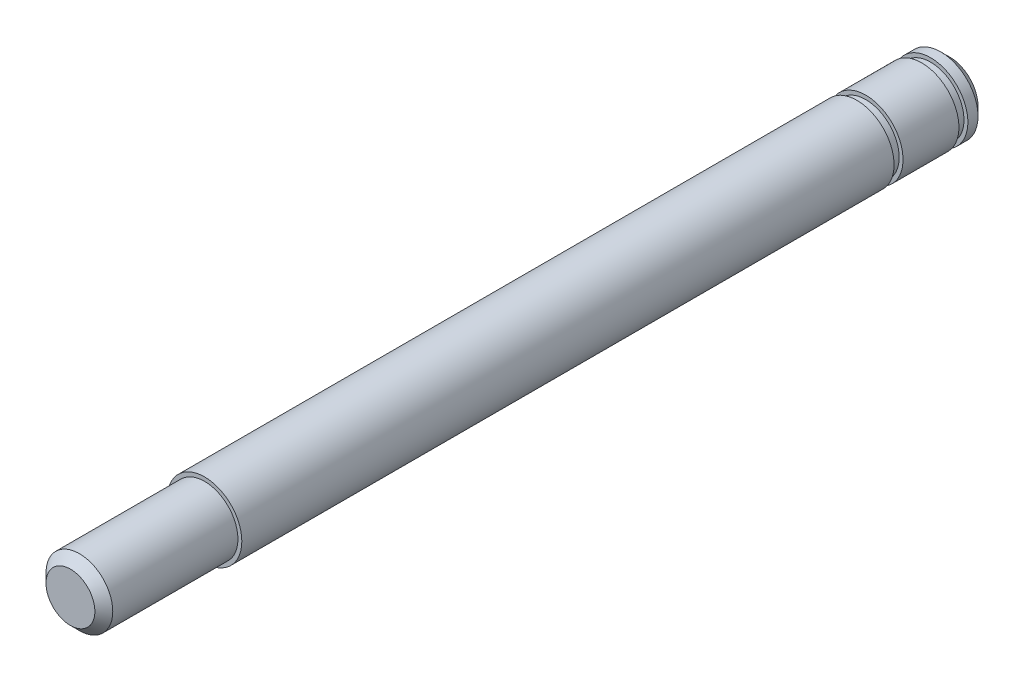
ISO-10303-21;
HEADER;
FILE_DESCRIPTION(('STEP AP214'),'2;1');
FILE_NAME('part.step','',(''),(''),'','','');
FILE_SCHEMA(('AUTOMOTIVE_DESIGN { 1 0 10303 214 1 1 1 1 }'));
ENDSEC;
DATA;
#1=APPLICATION_CONTEXT('core data for automotive mechanical design processes');
#2=APPLICATION_PROTOCOL_DEFINITION('international standard','automotive_design',2000,#1);
#3=PRODUCT_CONTEXT('',#1,'mechanical');
#4=PRODUCT('Part','Part','',(#3));
#5=PRODUCT_RELATED_PRODUCT_CATEGORY('part','',(#4));
#6=PRODUCT_DEFINITION_FORMATION('','',#4);
#7=PRODUCT_DEFINITION_CONTEXT('part definition',#1,'design');
#8=PRODUCT_DEFINITION('design','',#6,#7);
#9=PRODUCT_DEFINITION_SHAPE('','',#8);
#10=(LENGTH_UNIT() NAMED_UNIT(*) SI_UNIT(.MILLI.,.METRE.));
#11=(NAMED_UNIT(*) PLANE_ANGLE_UNIT() SI_UNIT($,.RADIAN.));
#12=(NAMED_UNIT(*) SI_UNIT($,.STERADIAN.) SOLID_ANGLE_UNIT());
#13=UNCERTAINTY_MEASURE_WITH_UNIT(LENGTH_MEASURE(1.E-05),#10,'distance_accuracy_value','');
#14=(GEOMETRIC_REPRESENTATION_CONTEXT(3) GLOBAL_UNCERTAINTY_ASSIGNED_CONTEXT((#13)) GLOBAL_UNIT_ASSIGNED_CONTEXT((#10,
#11,#12)) REPRESENTATION_CONTEXT('',''));
#15=CARTESIAN_POINT('',(0.,0.,0.));
#16=DIRECTION('',(0.,0.,1.));
#17=DIRECTION('',(1.,0.,0.));
#18=AXIS2_PLACEMENT_3D('',#15,#16,#17);
#19=CARTESIAN_POINT('',(0.,0.,15.875));
#20=DIRECTION('',(0.,0.,-1.));
#21=DIRECTION('',(-1.,0.,0.));
#22=AXIS2_PLACEMENT_3D('',#19,#20,#21);
#23=CYLINDRICAL_SURFACE('',#22,1.5875);
#24=CARTESIAN_POINT('',(0.,0.,-12.29995));
#25=DIRECTION('',(0.,0.,-1.));
#26=DIRECTION('',(-1.,0.,0.));
#27=AXIS2_PLACEMENT_3D('',#24,#25,#26);
#28=CIRCLE('',#27,1.5875);
#29=CARTESIAN_POINT('',(-1.5875,0.,-12.29995));
#30=VERTEX_POINT('',#29);
#31=EDGE_CURVE('E83',#30,#30,#28,.T.);
#32=ORIENTED_EDGE('',*,*,#31,.T.);
#33=EDGE_LOOP('',(#32));
#34=FACE_BOUND('',#33,.T.);
#35=CARTESIAN_POINT('',(0.,0.,-14.6812));
#36=DIRECTION('',(0.,0.,-1.));
#37=DIRECTION('',(-1.,0.,0.));
#38=AXIS2_PLACEMENT_3D('',#35,#36,#37);
#39=CIRCLE('',#38,1.5875);
#40=CARTESIAN_POINT('',(-1.5875,0.,-14.6812));
#41=VERTEX_POINT('',#40);
#42=EDGE_CURVE('E68',#41,#41,#39,.T.);
#43=ORIENTED_EDGE('',*,*,#42,.F.);
#44=EDGE_LOOP('',(#43));
#45=FACE_BOUND('',#44,.T.);
#46=ADVANCED_FACE('F44',(#34,#45),#23,.T.);
#47=CARTESIAN_POINT('',(0.,0.,-14.6812));
#48=DIRECTION('',(0.,0.,-1.));
#49=DIRECTION('',(-1.,0.,0.));
#50=AXIS2_PLACEMENT_3D('',#47,#48,#49);
#51=PLANE('',#50);
#52=CARTESIAN_POINT('',(0.,0.,-14.6812));
#53=DIRECTION('',(0.,0.,-1.));
#54=DIRECTION('',(-1.,0.,0.));
#55=AXIS2_PLACEMENT_3D('',#52,#53,#54);
#56=CIRCLE('',#55,1.4224);
#57=CARTESIAN_POINT('',(-1.4224,0.,-14.6812));
#58=VERTEX_POINT('',#57);
#59=EDGE_CURVE('E74',#58,#58,#56,.T.);
#60=ORIENTED_EDGE('',*,*,#59,.F.);
#61=EDGE_LOOP('',(#60));
#62=FACE_BOUND('',#61,.T.);
#63=ORIENTED_EDGE('',*,*,#42,.T.);
#64=EDGE_LOOP('',(#63));
#65=FACE_BOUND('',#64,.T.);
#66=ADVANCED_FACE('F123',(#62,#65),#51,.T.);
#67=CARTESIAN_POINT('',(0.,0.,-15.0622));
#68=DIRECTION('',(0.,0.,-1.));
#69=DIRECTION('',(-1.,0.,0.));
#70=AXIS2_PLACEMENT_3D('',#67,#68,#69);
#71=PLANE('',#70);
#72=CARTESIAN_POINT('',(0.,0.,-15.0622));
#73=DIRECTION('',(0.,0.,-1.));
#74=DIRECTION('',(-1.,0.,0.));
#75=AXIS2_PLACEMENT_3D('',#72,#73,#74);
#76=CIRCLE('',#75,1.4224);
#77=CARTESIAN_POINT('',(-1.4224,0.,-15.0622));
#78=VERTEX_POINT('',#77);
#79=EDGE_CURVE('E77',#78,#78,#76,.T.);
#80=ORIENTED_EDGE('',*,*,#79,.T.);
#81=EDGE_LOOP('',(#80));
#82=FACE_BOUND('',#81,.T.);
#83=CARTESIAN_POINT('',(0.,0.,-15.0622));
#84=DIRECTION('',(0.,0.,-1.));
#85=DIRECTION('',(-1.,0.,0.));
#86=AXIS2_PLACEMENT_3D('',#83,#84,#85);
#87=CIRCLE('',#86,1.5875);
#88=CARTESIAN_POINT('',(-1.5875,0.,-15.0622));
#89=VERTEX_POINT('',#88);
#90=EDGE_CURVE('E71',#89,#89,#87,.T.);
#91=ORIENTED_EDGE('',*,*,#90,.F.);
#92=EDGE_LOOP('',(#91));
#93=FACE_BOUND('',#92,.T.);
#94=ADVANCED_FACE('F134',(#82,#93),#71,.F.);
#95=CARTESIAN_POINT('',(0.,0.,-14.6812));
#96=DIRECTION('',(0.,0.,-1.));
#97=DIRECTION('',(-1.,0.,0.));
#98=AXIS2_PLACEMENT_3D('',#95,#96,#97);
#99=CYLINDRICAL_SURFACE('',#98,1.4224);
#100=CARTESIAN_POINT('',(-1.4224,0.,-14.6812));
#101=CARTESIAN_POINT('',(-1.4224,0.,-14.68516875));
#102=CARTESIAN_POINT('',(-1.4224,0.,-14.6891375));
#103=CARTESIAN_POINT('',(-1.4224,0.,-14.697075));
#104=CARTESIAN_POINT('',(-1.4224,0.,-14.70104375));
#105=CARTESIAN_POINT('',(-1.4224,0.,-14.70898125));
#106=CARTESIAN_POINT('',(-1.4224,0.,-14.71295));
#107=CARTESIAN_POINT('',(-1.4224,0.,-14.7208875));
#108=CARTESIAN_POINT('',(-1.4224,0.,-14.72485625));
#109=CARTESIAN_POINT('',(-1.4224,0.,-14.73279375));
#110=CARTESIAN_POINT('',(-1.4224,0.,-14.7367625));
#111=CARTESIAN_POINT('',(-1.4224,0.,-14.7447));
#112=CARTESIAN_POINT('',(-1.4224,0.,-14.74866875));
#113=CARTESIAN_POINT('',(-1.4224,0.,-14.75660625));
#114=CARTESIAN_POINT('',(-1.4224,0.,-14.760575));
#115=CARTESIAN_POINT('',(-1.4224,0.,-14.7685125));
#116=CARTESIAN_POINT('',(-1.4224,0.,-14.77248125));
#117=CARTESIAN_POINT('',(-1.4224,0.,-14.78041875));
#118=CARTESIAN_POINT('',(-1.4224,0.,-14.7843875));
#119=CARTESIAN_POINT('',(-1.4224,0.,-14.792325));
#120=CARTESIAN_POINT('',(-1.4224,0.,-14.79629375));
#121=CARTESIAN_POINT('',(-1.4224,0.,-14.80423125));
#122=CARTESIAN_POINT('',(-1.4224,0.,-14.8082));
#123=CARTESIAN_POINT('',(-1.4224,0.,-14.8161375));
#124=CARTESIAN_POINT('',(-1.4224,0.,-14.82010625));
#125=CARTESIAN_POINT('',(-1.4224,0.,-14.82804375));
#126=CARTESIAN_POINT('',(-1.4224,0.,-14.8320125));
#127=CARTESIAN_POINT('',(-1.4224,0.,-14.83995));
#128=CARTESIAN_POINT('',(-1.4224,0.,-14.84391875));
#129=CARTESIAN_POINT('',(-1.4224,0.,-14.85185625));
#130=CARTESIAN_POINT('',(-1.4224,0.,-14.855825));
#131=CARTESIAN_POINT('',(-1.4224,0.,-14.8637625));
#132=CARTESIAN_POINT('',(-1.4224,0.,-14.86773125));
#133=CARTESIAN_POINT('',(-1.4224,0.,-14.87566875));
#134=CARTESIAN_POINT('',(-1.4224,0.,-14.8796375));
#135=CARTESIAN_POINT('',(-1.4224,0.,-14.887575));
#136=CARTESIAN_POINT('',(-1.4224,0.,-14.89154375));
#137=CARTESIAN_POINT('',(-1.4224,0.,-14.89948125));
#138=CARTESIAN_POINT('',(-1.4224,0.,-14.90345));
#139=CARTESIAN_POINT('',(-1.4224,0.,-14.9113875));
#140=CARTESIAN_POINT('',(-1.4224,0.,-14.91535625));
#141=CARTESIAN_POINT('',(-1.4224,0.,-14.92329375));
#142=CARTESIAN_POINT('',(-1.4224,0.,-14.9272625));
#143=CARTESIAN_POINT('',(-1.4224,0.,-14.9352));
#144=CARTESIAN_POINT('',(-1.4224,0.,-14.93916875));
#145=CARTESIAN_POINT('',(-1.4224,0.,-14.94710625));
#146=CARTESIAN_POINT('',(-1.4224,0.,-14.951075));
#147=CARTESIAN_POINT('',(-1.4224,0.,-14.9590125));
#148=CARTESIAN_POINT('',(-1.4224,0.,-14.96298125));
#149=CARTESIAN_POINT('',(-1.4224,0.,-14.97091875));
#150=CARTESIAN_POINT('',(-1.4224,0.,-14.9748875));
#151=CARTESIAN_POINT('',(-1.4224,0.,-14.982825));
#152=CARTESIAN_POINT('',(-1.4224,0.,-14.98679375));
#153=CARTESIAN_POINT('',(-1.4224,0.,-14.99473125));
#154=CARTESIAN_POINT('',(-1.4224,0.,-14.9987));
#155=CARTESIAN_POINT('',(-1.4224,0.,-15.0066375));
#156=CARTESIAN_POINT('',(-1.4224,0.,-15.01060625));
#157=CARTESIAN_POINT('',(-1.4224,0.,-15.01854375));
#158=CARTESIAN_POINT('',(-1.4224,0.,-15.0225125));
#159=CARTESIAN_POINT('',(-1.4224,0.,-15.03045));
#160=CARTESIAN_POINT('',(-1.4224,0.,-15.03441875));
#161=CARTESIAN_POINT('',(-1.4224,0.,-15.04235625));
#162=CARTESIAN_POINT('',(-1.4224,0.,-15.046325));
#163=CARTESIAN_POINT('',(-1.4224,0.,-15.0542625));
#164=CARTESIAN_POINT('',(-1.4224,0.,-15.05823125));
#165=CARTESIAN_POINT('',(-1.4224,0.,-15.0622));
#166=B_SPLINE_CURVE_WITH_KNOTS('',3,(#100,#101,#102,#103,#104,#105,#106,#107,#108,#109,#110,
#111,#112,#113,#114,#115,#116,#117,#118,#119,#120,#121,#122,#123,#124,#125,#126,#127,#128,#129,
#130,#131,#132,#133,#134,#135,#136,#137,#138,#139,#140,#141,#142,#143,#144,#145,#146,#147,#148,
#149,#150,#151,#152,#153,#154,#155,#156,#157,#158,#159,#160,#161,#162,#163,#164,#165),
.UNSPECIFIED.,.F.,.F.,(4,2,2,2,2,2,2,2,2,2,2,2,2,2,2,2,2,2,2,2,2,2,2,2,2,2,2,2,2,2,2,2,4),(0.,
0.0119062500000006,0.0238125000000013,0.0357187500000002,0.0476250000000008,0.0595312500000014,
0.0714375000000003,0.083343750000001,0.0952500000000016,0.10715625,0.119062500000001,0.13096875,
0.142875000000001,0.154781250000001,0.1666875,0.178593750000001,0.190500000000001,0.20240625,
0.214312500000001,0.22621875,0.238125,0.250031250000001,0.2619375,0.273843750000001,
0.285750000000001,0.29765625,0.309562500000001,0.32146875,0.333375,0.345281250000001,0.3571875,
0.36909375,0.381000000000001),.UNSPECIFIED.);
#167=EDGE_CURVE('BSEAM130',#58,#78,#166,.T.);
#168=ORIENTED_EDGE('',*,*,#59,.T.);
#169=ORIENTED_EDGE('',*,*,#79,.F.);
#170=ORIENTED_EDGE('',*,*,#167,.T.);
#171=ORIENTED_EDGE('',*,*,#167,.F.);
#172=EDGE_LOOP('',(#168,#170,#169,#171));
#173=FACE_BOUND('',#172,.T.);
#174=ADVANCED_FACE('F130',(#173),#99,.T.);
#175=CARTESIAN_POINT('',(0.,0.,-15.875));
#176=DIRECTION('',(0.,0.,1.));
#177=DIRECTION('',(1.,0.,0.));
#178=AXIS2_PLACEMENT_3D('',#175,#176,#177);
#179=PLANE('',#178);
#180=CARTESIAN_POINT('',(0.,0.,-15.875));
#181=DIRECTION('',(0.,0.,1.));
#182=DIRECTION('',(1.,0.,0.));
#183=AXIS2_PLACEMENT_3D('',#180,#181,#182);
#184=CIRCLE('',#183,1.20650000000001);
#185=CARTESIAN_POINT('',(1.20650000000001,0.,-15.875));
#186=VERTEX_POINT('',#185);
#187=EDGE_CURVE('E11',#186,#186,#184,.F.);
#188=ORIENTED_EDGE('',*,*,#187,.T.);
#189=EDGE_LOOP('',(#188));
#190=FACE_BOUND('',#189,.T.);
#191=ADVANCED_FACE('F126',(#190),#179,.F.);
#192=CARTESIAN_POINT('',(0.,0.,-15.494));
#193=DIRECTION('',(0.,0.,1.));
#194=DIRECTION('',(1.,0.,0.));
#195=AXIS2_PLACEMENT_3D('',#192,#193,#194);
#196=CIRCLE('',#195,1.5875);
#197=CARTESIAN_POINT('',(1.5875,0.,-15.494));
#198=VERTEX_POINT('',#197);
#199=EDGE_CURVE('E51',#198,#198,#196,.T.);
#200=ORIENTED_EDGE('',*,*,#199,.T.);
#201=EDGE_LOOP('',(#200));
#202=FACE_BOUND('',#201,.T.);
#203=ORIENTED_EDGE('',*,*,#90,.T.);
#204=EDGE_LOOP('',(#203));
#205=FACE_BOUND('',#204,.T.);
#206=ADVANCED_FACE('F102',(#202,#205),#23,.T.);
#207=CARTESIAN_POINT('',(0.,0.,-11.91895));
#208=DIRECTION('',(0.,0.,-1.));
#209=DIRECTION('',(-1.,0.,0.));
#210=AXIS2_PLACEMENT_3D('',#207,#208,#209);
#211=PLANE('',#210);
#212=CARTESIAN_POINT('',(0.,0.,-11.91895));
#213=DIRECTION('',(0.,0.,-1.));
#214=DIRECTION('',(-1.,0.,0.));
#215=AXIS2_PLACEMENT_3D('',#212,#213,#214);
#216=CIRCLE('',#215,1.4224);
#217=CARTESIAN_POINT('',(-1.4224,0.,-11.91895));
#218=VERTEX_POINT('',#217);
#219=EDGE_CURVE('E86',#218,#218,#216,.T.);
#220=ORIENTED_EDGE('',*,*,#219,.F.);
#221=EDGE_LOOP('',(#220));
#222=FACE_BOUND('',#221,.T.);
#223=CARTESIAN_POINT('',(0.,0.,-11.91895));
#224=DIRECTION('',(0.,0.,-1.));
#225=DIRECTION('',(-1.,0.,0.));
#226=AXIS2_PLACEMENT_3D('',#223,#224,#225);
#227=CIRCLE('',#226,1.5875);
#228=CARTESIAN_POINT('',(-1.5875,0.,-11.91895));
#229=VERTEX_POINT('',#228);
#230=EDGE_CURVE('E80',#229,#229,#227,.T.);
#231=ORIENTED_EDGE('',*,*,#230,.T.);
#232=EDGE_LOOP('',(#231));
#233=FACE_BOUND('',#232,.T.);
#234=ADVANCED_FACE('F98',(#222,#233),#211,.T.);
#235=CARTESIAN_POINT('',(0.,0.,-12.29995));
#236=DIRECTION('',(0.,0.,-1.));
#237=DIRECTION('',(-1.,0.,0.));
#238=AXIS2_PLACEMENT_3D('',#235,#236,#237);
#239=PLANE('',#238);
#240=CARTESIAN_POINT('',(0.,0.,-12.29995));
#241=DIRECTION('',(0.,0.,-1.));
#242=DIRECTION('',(-1.,0.,0.));
#243=AXIS2_PLACEMENT_3D('',#240,#241,#242);
#244=CIRCLE('',#243,1.4224);
#245=CARTESIAN_POINT('',(-1.4224,0.,-12.29995));
#246=VERTEX_POINT('',#245);
#247=EDGE_CURVE('E89',#246,#246,#244,.T.);
#248=ORIENTED_EDGE('',*,*,#247,.T.);
#249=EDGE_LOOP('',(#248));
#250=FACE_BOUND('',#249,.T.);
#251=ORIENTED_EDGE('',*,*,#31,.F.);
#252=EDGE_LOOP('',(#251));
#253=FACE_BOUND('',#252,.T.);
#254=ADVANCED_FACE('F101',(#250,#253),#239,.F.);
#255=CARTESIAN_POINT('',(0.,0.,-11.91895));
#256=DIRECTION('',(0.,0.,-1.));
#257=DIRECTION('',(-1.,0.,0.));
#258=AXIS2_PLACEMENT_3D('',#255,#256,#257);
#259=CYLINDRICAL_SURFACE('',#258,1.4224);
#260=CARTESIAN_POINT('',(-1.4224,0.,-11.91895));
#261=CARTESIAN_POINT('',(-1.4224,0.,-11.92291875));
#262=CARTESIAN_POINT('',(-1.4224,0.,-11.9268875));
#263=CARTESIAN_POINT('',(-1.4224,0.,-11.934825));
#264=CARTESIAN_POINT('',(-1.4224,0.,-11.93879375));
#265=CARTESIAN_POINT('',(-1.4224,0.,-11.94673125));
#266=CARTESIAN_POINT('',(-1.4224,0.,-11.9507));
#267=CARTESIAN_POINT('',(-1.4224,0.,-11.9586375));
#268=CARTESIAN_POINT('',(-1.4224,0.,-11.96260625));
#269=CARTESIAN_POINT('',(-1.4224,0.,-11.97054375));
#270=CARTESIAN_POINT('',(-1.4224,0.,-11.9745125));
#271=CARTESIAN_POINT('',(-1.4224,0.,-11.98245));
#272=CARTESIAN_POINT('',(-1.4224,0.,-11.98641875));
#273=CARTESIAN_POINT('',(-1.4224,0.,-11.99435625));
#274=CARTESIAN_POINT('',(-1.4224,0.,-11.998325));
#275=CARTESIAN_POINT('',(-1.4224,0.,-12.0062625));
#276=CARTESIAN_POINT('',(-1.4224,0.,-12.01023125));
#277=CARTESIAN_POINT('',(-1.4224,0.,-12.01816875));
#278=CARTESIAN_POINT('',(-1.4224,0.,-12.0221375));
#279=CARTESIAN_POINT('',(-1.4224,0.,-12.030075));
#280=CARTESIAN_POINT('',(-1.4224,0.,-12.03404375));
#281=CARTESIAN_POINT('',(-1.4224,0.,-12.04198125));
#282=CARTESIAN_POINT('',(-1.4224,0.,-12.04595));
#283=CARTESIAN_POINT('',(-1.4224,0.,-12.0538875));
#284=CARTESIAN_POINT('',(-1.4224,0.,-12.05785625));
#285=CARTESIAN_POINT('',(-1.4224,0.,-12.06579375));
#286=CARTESIAN_POINT('',(-1.4224,0.,-12.0697625));
#287=CARTESIAN_POINT('',(-1.4224,0.,-12.0777));
#288=CARTESIAN_POINT('',(-1.4224,0.,-12.08166875));
#289=CARTESIAN_POINT('',(-1.4224,0.,-12.08960625));
#290=CARTESIAN_POINT('',(-1.4224,0.,-12.093575));
#291=CARTESIAN_POINT('',(-1.4224,0.,-12.1015125));
#292=CARTESIAN_POINT('',(-1.4224,0.,-12.10548125));
#293=CARTESIAN_POINT('',(-1.4224,0.,-12.11341875));
#294=CARTESIAN_POINT('',(-1.4224,0.,-12.1173875));
#295=CARTESIAN_POINT('',(-1.4224,0.,-12.125325));
#296=CARTESIAN_POINT('',(-1.4224,0.,-12.12929375));
#297=CARTESIAN_POINT('',(-1.4224,0.,-12.13723125));
#298=CARTESIAN_POINT('',(-1.4224,0.,-12.1412));
#299=CARTESIAN_POINT('',(-1.4224,0.,-12.1491375));
#300=CARTESIAN_POINT('',(-1.4224,0.,-12.15310625));
#301=CARTESIAN_POINT('',(-1.4224,0.,-12.16104375));
#302=CARTESIAN_POINT('',(-1.4224,0.,-12.1650125));
#303=CARTESIAN_POINT('',(-1.4224,0.,-12.17295));
#304=CARTESIAN_POINT('',(-1.4224,0.,-12.17691875));
#305=CARTESIAN_POINT('',(-1.4224,0.,-12.18485625));
#306=CARTESIAN_POINT('',(-1.4224,0.,-12.188825));
#307=CARTESIAN_POINT('',(-1.4224,0.,-12.1967625));
#308=CARTESIAN_POINT('',(-1.4224,0.,-12.20073125));
#309=CARTESIAN_POINT('',(-1.4224,0.,-12.20866875));
#310=CARTESIAN_POINT('',(-1.4224,0.,-12.2126375));
#311=CARTESIAN_POINT('',(-1.4224,0.,-12.220575));
#312=CARTESIAN_POINT('',(-1.4224,0.,-12.22454375));
#313=CARTESIAN_POINT('',(-1.4224,0.,-12.23248125));
#314=CARTESIAN_POINT('',(-1.4224,0.,-12.23645));
#315=CARTESIAN_POINT('',(-1.4224,0.,-12.2443875));
#316=CARTESIAN_POINT('',(-1.4224,0.,-12.24835625));
#317=CARTESIAN_POINT('',(-1.4224,0.,-12.25629375));
#318=CARTESIAN_POINT('',(-1.4224,0.,-12.2602625));
#319=CARTESIAN_POINT('',(-1.4224,0.,-12.2682));
#320=CARTESIAN_POINT('',(-1.4224,0.,-12.27216875));
#321=CARTESIAN_POINT('',(-1.4224,0.,-12.28010625));
#322=CARTESIAN_POINT('',(-1.4224,0.,-12.284075));
#323=CARTESIAN_POINT('',(-1.4224,0.,-12.2920125));
#324=CARTESIAN_POINT('',(-1.4224,0.,-12.29598125));
#325=CARTESIAN_POINT('',(-1.4224,0.,-12.29995));
#326=B_SPLINE_CURVE_WITH_KNOTS('',3,(#260,#261,#262,#263,#264,#265,#266,#267,#268,#269,#270,
#271,#272,#273,#274,#275,#276,#277,#278,#279,#280,#281,#282,#283,#284,#285,#286,#287,#288,#289,
#290,#291,#292,#293,#294,#295,#296,#297,#298,#299,#300,#301,#302,#303,#304,#305,#306,#307,#308,
#309,#310,#311,#312,#313,#314,#315,#316,#317,#318,#319,#320,#321,#322,#323,#324,#325),
.UNSPECIFIED.,.F.,.F.,(4,2,2,2,2,2,2,2,2,2,2,2,2,2,2,2,2,2,2,2,2,2,2,2,2,2,2,2,2,2,2,2,4),(0.,
0.0119062500000006,0.0238125000000013,0.0357187500000002,0.0476250000000008,0.0595312500000014,
0.0714375000000003,0.083343750000001,0.0952499999999998,0.10715625,0.119062500000001,0.13096875,
0.142875000000001,0.154781250000001,0.1666875,0.178593750000001,0.1905,0.20240625,
0.214312500000001,0.22621875,0.238125,0.250031250000001,0.2619375,0.273843750000001,0.28575,
0.29765625,0.309562500000001,0.32146875,0.333375,0.345281250000001,0.3571875,0.36909375,
0.380999999999999),.UNSPECIFIED.);
#327=EDGE_CURVE('BSEAM95',#218,#246,#326,.T.);
#328=ORIENTED_EDGE('',*,*,#219,.T.);
#329=ORIENTED_EDGE('',*,*,#247,.F.);
#330=ORIENTED_EDGE('',*,*,#327,.T.);
#331=ORIENTED_EDGE('',*,*,#327,.F.);
#332=EDGE_LOOP('',(#328,#330,#329,#331));
#333=FACE_BOUND('',#332,.T.);
#334=ADVANCED_FACE('F95',(#333),#259,.T.);
#335=CARTESIAN_POINT('',(0.,0.,21.59));
#336=DIRECTION('',(0.,0.,1.));
#337=DIRECTION('',(1.,0.,0.));
#338=AXIS2_PLACEMENT_3D('',#335,#336,#337);
#339=PLANE('',#338);
#340=CARTESIAN_POINT('',(0.,0.,21.59));
#341=DIRECTION('',(0.,0.,1.));
#342=DIRECTION('',(1.,0.,0.));
#343=AXIS2_PLACEMENT_3D('',#340,#341,#342);
#344=CIRCLE('',#343,1.0414);
#345=CARTESIAN_POINT('',(1.0414,0.,21.59));
#346=VERTEX_POINT('',#345);
#347=EDGE_CURVE('E59',#346,#346,#344,.T.);
#348=ORIENTED_EDGE('',*,*,#347,.T.);
#349=EDGE_LOOP('',(#348));
#350=FACE_BOUND('',#349,.T.);
#351=ADVANCED_FACE('F147',(#350),#339,.T.);
#352=CARTESIAN_POINT('',(0.,0.,21.59));
#353=DIRECTION('',(0.,0.,-1.));
#354=DIRECTION('',(-1.,0.,0.));
#355=AXIS2_PLACEMENT_3D('',#352,#353,#354);
#356=CYLINDRICAL_SURFACE('',#355,1.4224);
#357=CARTESIAN_POINT('',(0.,0.,21.209));
#358=DIRECTION('',(0.,0.,1.));
#359=DIRECTION('',(1.,0.,0.));
#360=AXIS2_PLACEMENT_3D('',#357,#358,#359);
#361=CIRCLE('',#360,1.4224);
#362=CARTESIAN_POINT('',(1.4224,0.,21.209));
#363=VERTEX_POINT('',#362);
#364=EDGE_CURVE('E55',#363,#363,#361,.F.);
#365=ORIENTED_EDGE('',*,*,#364,.T.);
#366=EDGE_LOOP('',(#365));
#367=FACE_BOUND('',#366,.T.);
#368=CARTESIAN_POINT('',(0.,0.,15.875));
#369=DIRECTION('',(0.,0.,1.));
#370=DIRECTION('',(1.,0.,0.));
#371=AXIS2_PLACEMENT_3D('',#368,#369,#370);
#372=CIRCLE('',#371,1.4224);
#373=CARTESIAN_POINT('',(1.4224,0.,15.875));
#374=VERTEX_POINT('',#373);
#375=EDGE_CURVE('E64',#374,#374,#372,.T.);
#376=ORIENTED_EDGE('',*,*,#375,.T.);
#377=EDGE_LOOP('',(#376));
#378=FACE_BOUND('',#377,.T.);
#379=ADVANCED_FACE('F117',(#367,#378),#356,.T.);
#380=CARTESIAN_POINT('',(0.,0.,15.875));
#381=DIRECTION('',(0.,0.,1.));
#382=DIRECTION('',(1.,0.,0.));
#383=AXIS2_PLACEMENT_3D('',#380,#381,#382);
#384=PLANE('',#383);
#385=ORIENTED_EDGE('',*,*,#375,.F.);
#386=EDGE_LOOP('',(#385));
#387=FACE_BOUND('',#386,.T.);
#388=CARTESIAN_POINT('',(0.,0.,15.875));
#389=DIRECTION('',(0.,0.,1.));
#390=DIRECTION('',(1.,0.,0.));
#391=AXIS2_PLACEMENT_3D('',#388,#389,#390);
#392=CIRCLE('',#391,1.5875);
#393=CARTESIAN_POINT('',(1.5875,0.,15.875));
#394=VERTEX_POINT('',#393);
#395=EDGE_CURVE('E65',#394,#394,#392,.T.);
#396=ORIENTED_EDGE('',*,*,#395,.T.);
#397=EDGE_LOOP('',(#396));
#398=FACE_BOUND('',#397,.T.);
#399=ADVANCED_FACE('F109',(#387,#398),#384,.T.);
#400=ORIENTED_EDGE('',*,*,#395,.F.);
#401=EDGE_LOOP('',(#400));
#402=FACE_BOUND('',#401,.T.);
#403=ORIENTED_EDGE('',*,*,#230,.F.);
#404=EDGE_LOOP('',(#403));
#405=FACE_BOUND('',#404,.T.);
#406=ADVANCED_FACE('F106',(#402,#405),#23,.T.);
#407=CARTESIAN_POINT('',(0.,0.,21.59));
#408=DIRECTION('',(0.,0.,-1.));
#409=DIRECTION('',(-1.,0.,0.));
#410=AXIS2_PLACEMENT_3D('',#407,#408,#409);
#411=CONICAL_SURFACE('',#410,1.0414,0.785398163397447);
#412=ORIENTED_EDGE('',*,*,#364,.F.);
#413=EDGE_LOOP('',(#412));
#414=FACE_BOUND('',#413,.T.);
#415=ORIENTED_EDGE('',*,*,#347,.F.);
#416=EDGE_LOOP('',(#415));
#417=FACE_BOUND('',#416,.T.);
#418=ADVANCED_FACE('F108',(#414,#417),#411,.T.);
#419=CARTESIAN_POINT('',(0.,0.,-15.494));
#420=DIRECTION('',(0.,0.,1.));
#421=DIRECTION('',(1.,0.,0.));
#422=AXIS2_PLACEMENT_3D('',#419,#420,#421);
#423=CONICAL_SURFACE('',#422,1.5875,0.78539816339745);
#424=ORIENTED_EDGE('',*,*,#187,.F.);
#425=EDGE_LOOP('',(#424));
#426=FACE_BOUND('',#425,.T.);
#427=ORIENTED_EDGE('',*,*,#199,.F.);
#428=EDGE_LOOP('',(#427));
#429=FACE_BOUND('',#428,.T.);
#430=ADVANCED_FACE('F46',(#426,#429),#423,.T.);
#431=CLOSED_SHELL('',(#46,#66,#94,#174,#191,#206,#234,#254,#334,#351,#379,#399,#406,#418,#430));
#432=MANIFOLD_SOLID_BREP('B2',#431);
#433=ADVANCED_BREP_SHAPE_REPRESENTATION('',(#18,#432),#14);
#434=SHAPE_DEFINITION_REPRESENTATION(#9,#433);
ENDSEC;
END-ISO-10303-21;
